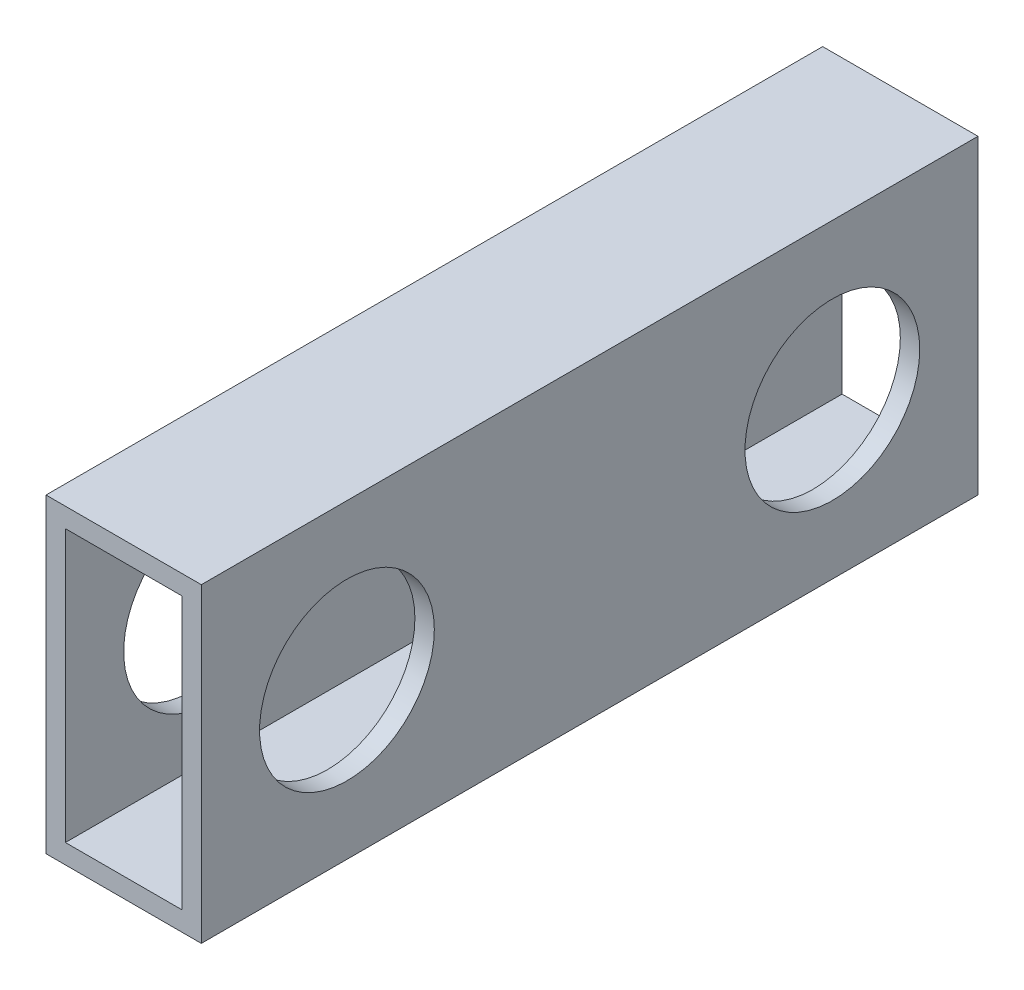
ISO-10303-21;
HEADER;
FILE_DESCRIPTION(('STEP AP214'),'2;1');
FILE_NAME('part.step','',(''),(''),'','','');
FILE_SCHEMA(('AUTOMOTIVE_DESIGN { 1 0 10303 214 1 1 1 1 }'));
ENDSEC;
DATA;
#1=APPLICATION_CONTEXT('core data for automotive mechanical design processes');
#2=APPLICATION_PROTOCOL_DEFINITION('international standard','automotive_design',2000,#1);
#3=PRODUCT_CONTEXT('',#1,'mechanical');
#4=PRODUCT('Part','Part','',(#3));
#5=PRODUCT_RELATED_PRODUCT_CATEGORY('part','',(#4));
#6=PRODUCT_DEFINITION_FORMATION('','',#4);
#7=PRODUCT_DEFINITION_CONTEXT('part definition',#1,'design');
#8=PRODUCT_DEFINITION('design','',#6,#7);
#9=PRODUCT_DEFINITION_SHAPE('','',#8);
#10=(LENGTH_UNIT() NAMED_UNIT(*) SI_UNIT(.MILLI.,.METRE.));
#11=(NAMED_UNIT(*) PLANE_ANGLE_UNIT() SI_UNIT($,.RADIAN.));
#12=(NAMED_UNIT(*) SI_UNIT($,.STERADIAN.) SOLID_ANGLE_UNIT());
#13=UNCERTAINTY_MEASURE_WITH_UNIT(LENGTH_MEASURE(1.E-05),#10,'distance_accuracy_value','');
#14=(GEOMETRIC_REPRESENTATION_CONTEXT(3) GLOBAL_UNCERTAINTY_ASSIGNED_CONTEXT((#13)) GLOBAL_UNIT_ASSIGNED_CONTEXT((#10,
#11,#12)) REPRESENTATION_CONTEXT('',''));
#15=CARTESIAN_POINT('',(0.,0.,0.));
#16=DIRECTION('',(0.,0.,1.));
#17=DIRECTION('',(1.,0.,0.));
#18=AXIS2_PLACEMENT_3D('',#15,#16,#17);
#19=CARTESIAN_POINT('',(12.7,25.4,63.5));
#20=DIRECTION('',(-1.,0.,0.));
#21=DIRECTION('',(0.,0.,1.));
#22=AXIS2_PLACEMENT_3D('',#19,#20,#21);
#23=PLANE('',#22);
#24=CARTESIAN_POINT('',(12.7,0.,-39.6875));
#25=DIRECTION('',(1.,0.,0.));
#26=DIRECTION('',(0.,0.,-1.));
#27=AXIS2_PLACEMENT_3D('',#24,#25,#26);
#28=CIRCLE('',#27,14.2875);
#29=CARTESIAN_POINT('',(12.7,0.,-53.975));
#30=VERTEX_POINT('',#29);
#31=EDGE_CURVE('E171',#30,#30,#28,.T.);
#32=ORIENTED_EDGE('',*,*,#31,.F.);
#33=EDGE_LOOP('',(#32));
#34=FACE_BOUND('',#33,.T.);
#35=CARTESIAN_POINT('',(12.7,0.,39.6875));
#36=DIRECTION('',(1.,0.,0.));
#37=DIRECTION('',(0.,0.,-1.));
#38=AXIS2_PLACEMENT_3D('',#35,#36,#37);
#39=CIRCLE('',#38,14.2875);
#40=CARTESIAN_POINT('',(12.7,0.,25.4));
#41=VERTEX_POINT('',#40);
#42=EDGE_CURVE('E176',#41,#41,#39,.T.);
#43=ORIENTED_EDGE('',*,*,#42,.F.);
#44=EDGE_LOOP('',(#43));
#45=FACE_BOUND('',#44,.T.);
#46=DIRECTION('',(0.,1.,0.));
#47=VECTOR('',#46,1.);
#48=CARTESIAN_POINT('',(12.7,25.4,-63.5));
#49=LINE('',#48,#47);
#50=CARTESIAN_POINT('',(12.7,-25.4,-63.5));
#51=VERTEX_POINT('',#50);
#52=CARTESIAN_POINT('',(12.7,25.4,-63.5));
#53=VERTEX_POINT('',#52);
#54=EDGE_CURVE('E148',#51,#53,#49,.T.);
#55=ORIENTED_EDGE('',*,*,#54,.T.);
#56=DIRECTION('',(0.,0.,-1.));
#57=VECTOR('',#56,1.);
#58=CARTESIAN_POINT('',(12.7,25.4,63.5));
#59=LINE('',#58,#57);
#60=CARTESIAN_POINT('',(12.7,25.4,63.5));
#61=VERTEX_POINT('',#60);
#62=EDGE_CURVE('E11',#61,#53,#59,.T.);
#63=ORIENTED_EDGE('',*,*,#62,.F.);
#64=DIRECTION('',(0.,1.,0.));
#65=VECTOR('',#64,1.);
#66=CARTESIAN_POINT('',(12.7,25.4,63.5));
#67=LINE('',#66,#65);
#68=CARTESIAN_POINT('',(12.7,-25.4,63.5));
#69=VERTEX_POINT('',#68);
#70=EDGE_CURVE('E137',#69,#61,#67,.T.);
#71=ORIENTED_EDGE('',*,*,#70,.F.);
#72=DIRECTION('',(0.,0.,-1.));
#73=VECTOR('',#72,1.);
#74=CARTESIAN_POINT('',(12.7,-25.4,63.5));
#75=LINE('',#74,#73);
#76=EDGE_CURVE('E147',#69,#51,#75,.T.);
#77=ORIENTED_EDGE('',*,*,#76,.T.);
#78=EDGE_LOOP('',(#55,#63,#71,#77));
#79=FACE_BOUND('',#78,.T.);
#80=ADVANCED_FACE('F37',(#34,#45,#79),#23,.F.);
#81=CARTESIAN_POINT('',(-12.7,25.4,63.5));
#82=DIRECTION('',(0.,-1.,0.));
#83=DIRECTION('',(0.,0.,-1.));
#84=AXIS2_PLACEMENT_3D('',#81,#82,#83);
#85=PLANE('',#84);
#86=DIRECTION('',(-1.,0.,0.));
#87=VECTOR('',#86,1.);
#88=CARTESIAN_POINT('',(-12.7,25.4,-63.5));
#89=LINE('',#88,#87);
#90=CARTESIAN_POINT('',(-12.7,25.4,-63.5));
#91=VERTEX_POINT('',#90);
#92=EDGE_CURVE('E151',#53,#91,#89,.T.);
#93=ORIENTED_EDGE('',*,*,#92,.T.);
#94=DIRECTION('',(0.,0.,-1.));
#95=VECTOR('',#94,1.);
#96=CARTESIAN_POINT('',(-12.7,25.4,63.5));
#97=LINE('',#96,#95);
#98=CARTESIAN_POINT('',(-12.7,25.4,63.5));
#99=VERTEX_POINT('',#98);
#100=EDGE_CURVE('E45',#99,#91,#97,.T.);
#101=ORIENTED_EDGE('',*,*,#100,.F.);
#102=DIRECTION('',(-1.,0.,0.));
#103=VECTOR('',#102,1.);
#104=CARTESIAN_POINT('',(-12.7,25.4,63.5));
#105=LINE('',#104,#103);
#106=EDGE_CURVE('E140',#61,#99,#105,.T.);
#107=ORIENTED_EDGE('',*,*,#106,.F.);
#108=ORIENTED_EDGE('',*,*,#62,.T.);
#109=EDGE_LOOP('',(#93,#101,#107,#108));
#110=FACE_BOUND('',#109,.T.);
#111=ADVANCED_FACE('F209',(#110),#85,.F.);
#112=CARTESIAN_POINT('',(-12.7,25.4,63.5));
#113=DIRECTION('',(1.,0.,0.));
#114=DIRECTION('',(0.,0.,-1.));
#115=AXIS2_PLACEMENT_3D('',#112,#113,#114);
#116=PLANE('',#115);
#117=CARTESIAN_POINT('',(-12.7,0.,-39.6875));
#118=DIRECTION('',(1.,0.,0.));
#119=DIRECTION('',(0.,0.,-1.));
#120=AXIS2_PLACEMENT_3D('',#117,#118,#119);
#121=CIRCLE('',#120,14.2875);
#122=CARTESIAN_POINT('',(-12.7,0.,-53.975));
#123=VERTEX_POINT('',#122);
#124=EDGE_CURVE('E165',#123,#123,#121,.T.);
#125=ORIENTED_EDGE('',*,*,#124,.T.);
#126=EDGE_LOOP('',(#125));
#127=FACE_BOUND('',#126,.T.);
#128=CARTESIAN_POINT('',(-12.7,0.,39.6875));
#129=DIRECTION('',(1.,0.,0.));
#130=DIRECTION('',(0.,0.,-1.));
#131=AXIS2_PLACEMENT_3D('',#128,#129,#130);
#132=CIRCLE('',#131,14.2875);
#133=CARTESIAN_POINT('',(-12.7,0.,25.4));
#134=VERTEX_POINT('',#133);
#135=EDGE_CURVE('E181',#134,#134,#132,.T.);
#136=ORIENTED_EDGE('',*,*,#135,.T.);
#137=EDGE_LOOP('',(#136));
#138=FACE_BOUND('',#137,.T.);
#139=DIRECTION('',(0.,-1.,0.));
#140=VECTOR('',#139,1.);
#141=CARTESIAN_POINT('',(-12.7,25.4,-63.5));
#142=LINE('',#141,#140);
#143=CARTESIAN_POINT('',(-12.7,-25.4,-63.5));
#144=VERTEX_POINT('',#143);
#145=EDGE_CURVE('E153',#91,#144,#142,.T.);
#146=ORIENTED_EDGE('',*,*,#145,.T.);
#147=DIRECTION('',(0.,0.,-1.));
#148=VECTOR('',#147,1.);
#149=CARTESIAN_POINT('',(-12.7,-25.4,63.5));
#150=LINE('',#149,#148);
#151=CARTESIAN_POINT('',(-12.7,-25.4,63.5));
#152=VERTEX_POINT('',#151);
#153=EDGE_CURVE('E158',#152,#144,#150,.T.);
#154=ORIENTED_EDGE('',*,*,#153,.F.);
#155=DIRECTION('',(0.,-1.,0.));
#156=VECTOR('',#155,1.);
#157=CARTESIAN_POINT('',(-12.7,25.4,63.5));
#158=LINE('',#157,#156);
#159=EDGE_CURVE('E143',#99,#152,#158,.T.);
#160=ORIENTED_EDGE('',*,*,#159,.F.);
#161=ORIENTED_EDGE('',*,*,#100,.T.);
#162=EDGE_LOOP('',(#146,#154,#160,#161));
#163=FACE_BOUND('',#162,.T.);
#164=ADVANCED_FACE('F216',(#127,#138,#163),#116,.F.);
#165=CARTESIAN_POINT('',(-12.7,-25.4,63.5));
#166=DIRECTION('',(0.,1.,0.));
#167=DIRECTION('',(0.,0.,1.));
#168=AXIS2_PLACEMENT_3D('',#165,#166,#167);
#169=PLANE('',#168);
#170=DIRECTION('',(1.,0.,0.));
#171=VECTOR('',#170,1.);
#172=CARTESIAN_POINT('',(-12.7,-25.4,-63.5));
#173=LINE('',#172,#171);
#174=EDGE_CURVE('E141',#144,#51,#173,.T.);
#175=ORIENTED_EDGE('',*,*,#174,.T.);
#176=ORIENTED_EDGE('',*,*,#76,.F.);
#177=DIRECTION('',(1.,0.,0.));
#178=VECTOR('',#177,1.);
#179=CARTESIAN_POINT('',(-12.7,-25.4,63.5));
#180=LINE('',#179,#178);
#181=EDGE_CURVE('E145',#152,#69,#180,.T.);
#182=ORIENTED_EDGE('',*,*,#181,.F.);
#183=ORIENTED_EDGE('',*,*,#153,.T.);
#184=EDGE_LOOP('',(#175,#176,#182,#183));
#185=FACE_BOUND('',#184,.T.);
#186=ADVANCED_FACE('F233',(#185),#169,.F.);
#187=CARTESIAN_POINT('',(0.,0.,63.5));
#188=DIRECTION('',(0.,0.,1.));
#189=DIRECTION('',(1.,0.,0.));
#190=AXIS2_PLACEMENT_3D('',#187,#188,#189);
#191=PLANE('',#190);
#192=DIRECTION('',(0.,1.,0.));
#193=VECTOR('',#192,1.);
#194=CARTESIAN_POINT('',(9.525,25.4,63.5));
#195=LINE('',#194,#193);
#196=CARTESIAN_POINT('',(9.525,-22.225,63.5));
#197=VERTEX_POINT('',#196);
#198=CARTESIAN_POINT('',(9.525,22.225,63.5));
#199=VERTEX_POINT('',#198);
#200=EDGE_CURVE('E125',#197,#199,#195,.T.);
#201=ORIENTED_EDGE('',*,*,#200,.F.);
#202=DIRECTION('',(1.,0.,0.));
#203=VECTOR('',#202,1.);
#204=CARTESIAN_POINT('',(-12.7,-22.225,63.5));
#205=LINE('',#204,#203);
#206=CARTESIAN_POINT('',(-9.525,-22.225,63.5));
#207=VERTEX_POINT('',#206);
#208=EDGE_CURVE('E108',#207,#197,#205,.T.);
#209=ORIENTED_EDGE('',*,*,#208,.F.);
#210=DIRECTION('',(0.,-1.,0.));
#211=VECTOR('',#210,1.);
#212=CARTESIAN_POINT('',(-9.525,25.4,63.5));
#213=LINE('',#212,#211);
#214=CARTESIAN_POINT('',(-9.525,22.225,63.5));
#215=VERTEX_POINT('',#214);
#216=EDGE_CURVE('E134',#215,#207,#213,.T.);
#217=ORIENTED_EDGE('',*,*,#216,.F.);
#218=DIRECTION('',(-1.,0.,0.));
#219=VECTOR('',#218,1.);
#220=CARTESIAN_POINT('',(-12.7,22.225,63.5));
#221=LINE('',#220,#219);
#222=EDGE_CURVE('E127',#199,#215,#221,.T.);
#223=ORIENTED_EDGE('',*,*,#222,.F.);
#224=EDGE_LOOP('',(#201,#209,#217,#223));
#225=FACE_BOUND('',#224,.T.);
#226=ORIENTED_EDGE('',*,*,#70,.T.);
#227=ORIENTED_EDGE('',*,*,#106,.T.);
#228=ORIENTED_EDGE('',*,*,#159,.T.);
#229=ORIENTED_EDGE('',*,*,#181,.T.);
#230=EDGE_LOOP('',(#226,#227,#228,#229));
#231=FACE_BOUND('',#230,.T.);
#232=ADVANCED_FACE('F192',(#225,#231),#191,.T.);
#233=CARTESIAN_POINT('',(0.,0.,-63.5));
#234=DIRECTION('',(0.,0.,1.));
#235=DIRECTION('',(1.,0.,0.));
#236=AXIS2_PLACEMENT_3D('',#233,#234,#235);
#237=PLANE('',#236);
#238=DIRECTION('',(1.,0.,0.));
#239=VECTOR('',#238,1.);
#240=CARTESIAN_POINT('',(-12.7,-22.225,-63.5));
#241=LINE('',#240,#239);
#242=CARTESIAN_POINT('',(-9.525,-22.225,-63.5));
#243=VERTEX_POINT('',#242);
#244=CARTESIAN_POINT('',(9.525,-22.225,-63.5));
#245=VERTEX_POINT('',#244);
#246=EDGE_CURVE('E106',#243,#245,#241,.T.);
#247=ORIENTED_EDGE('',*,*,#246,.T.);
#248=DIRECTION('',(0.,1.,0.));
#249=VECTOR('',#248,1.);
#250=CARTESIAN_POINT('',(9.525,25.4,-63.5));
#251=LINE('',#250,#249);
#252=CARTESIAN_POINT('',(9.525,22.225,-63.5));
#253=VERTEX_POINT('',#252);
#254=EDGE_CURVE('E114',#245,#253,#251,.T.);
#255=ORIENTED_EDGE('',*,*,#254,.T.);
#256=DIRECTION('',(-1.,0.,0.));
#257=VECTOR('',#256,1.);
#258=CARTESIAN_POINT('',(-12.7,22.225,-63.5));
#259=LINE('',#258,#257);
#260=CARTESIAN_POINT('',(-9.525,22.225,-63.5));
#261=VERTEX_POINT('',#260);
#262=EDGE_CURVE('E120',#253,#261,#259,.T.);
#263=ORIENTED_EDGE('',*,*,#262,.T.);
#264=DIRECTION('',(0.,-1.,0.));
#265=VECTOR('',#264,1.);
#266=CARTESIAN_POINT('',(-9.525,25.4,-63.5));
#267=LINE('',#266,#265);
#268=EDGE_CURVE('E60',#261,#243,#267,.T.);
#269=ORIENTED_EDGE('',*,*,#268,.T.);
#270=EDGE_LOOP('',(#247,#255,#263,#269));
#271=FACE_BOUND('',#270,.T.);
#272=ORIENTED_EDGE('',*,*,#54,.F.);
#273=ORIENTED_EDGE('',*,*,#174,.F.);
#274=ORIENTED_EDGE('',*,*,#145,.F.);
#275=ORIENTED_EDGE('',*,*,#92,.F.);
#276=EDGE_LOOP('',(#272,#273,#274,#275));
#277=FACE_BOUND('',#276,.T.);
#278=ADVANCED_FACE('F123',(#271,#277),#237,.F.);
#279=CARTESIAN_POINT('',(9.525,25.4,63.5));
#280=DIRECTION('',(-1.,0.,0.));
#281=DIRECTION('',(0.,0.,1.));
#282=AXIS2_PLACEMENT_3D('',#279,#280,#281);
#283=PLANE('',#282);
#284=CARTESIAN_POINT('',(9.525,0.,-39.6875));
#285=DIRECTION('',(-1.,0.,0.));
#286=DIRECTION('',(0.,0.,1.));
#287=AXIS2_PLACEMENT_3D('',#284,#285,#286);
#288=CIRCLE('',#287,14.2875);
#289=CARTESIAN_POINT('',(9.525,0.,-25.4));
#290=VERTEX_POINT('',#289);
#291=EDGE_CURVE('E121',#290,#290,#288,.T.);
#292=ORIENTED_EDGE('',*,*,#291,.F.);
#293=EDGE_LOOP('',(#292));
#294=FACE_BOUND('',#293,.T.);
#295=CARTESIAN_POINT('',(9.525,0.,39.6875));
#296=DIRECTION('',(-1.,0.,0.));
#297=DIRECTION('',(0.,0.,1.));
#298=AXIS2_PLACEMENT_3D('',#295,#296,#297);
#299=CIRCLE('',#298,14.2875);
#300=CARTESIAN_POINT('',(9.525,0.,53.975));
#301=VERTEX_POINT('',#300);
#302=EDGE_CURVE('E164',#301,#301,#299,.T.);
#303=ORIENTED_EDGE('',*,*,#302,.F.);
#304=EDGE_LOOP('',(#303));
#305=FACE_BOUND('',#304,.T.);
#306=ORIENTED_EDGE('',*,*,#254,.F.);
#307=DIRECTION('',(0.,0.,-1.));
#308=VECTOR('',#307,1.);
#309=CARTESIAN_POINT('',(9.525,-22.225,63.5));
#310=LINE('',#309,#308);
#311=EDGE_CURVE('E102',#197,#245,#310,.T.);
#312=ORIENTED_EDGE('',*,*,#311,.F.);
#313=ORIENTED_EDGE('',*,*,#200,.T.);
#314=DIRECTION('',(0.,0.,-1.));
#315=VECTOR('',#314,1.);
#316=CARTESIAN_POINT('',(9.525,22.225,63.5));
#317=LINE('',#316,#315);
#318=EDGE_CURVE('E117',#199,#253,#317,.T.);
#319=ORIENTED_EDGE('',*,*,#318,.T.);
#320=EDGE_LOOP('',(#306,#312,#313,#319));
#321=FACE_BOUND('',#320,.T.);
#322=ADVANCED_FACE('F115',(#294,#305,#321),#283,.T.);
#323=CARTESIAN_POINT('',(-12.7,22.225,63.5));
#324=DIRECTION('',(0.,-1.,0.));
#325=DIRECTION('',(0.,0.,-1.));
#326=AXIS2_PLACEMENT_3D('',#323,#324,#325);
#327=PLANE('',#326);
#328=ORIENTED_EDGE('',*,*,#262,.F.);
#329=ORIENTED_EDGE('',*,*,#318,.F.);
#330=ORIENTED_EDGE('',*,*,#222,.T.);
#331=DIRECTION('',(0.,0.,-1.));
#332=VECTOR('',#331,1.);
#333=CARTESIAN_POINT('',(-9.525,22.225,63.5));
#334=LINE('',#333,#332);
#335=EDGE_CURVE('E186',#215,#261,#334,.T.);
#336=ORIENTED_EDGE('',*,*,#335,.T.);
#337=EDGE_LOOP('',(#328,#329,#330,#336));
#338=FACE_BOUND('',#337,.T.);
#339=ADVANCED_FACE('F195',(#338),#327,.T.);
#340=CARTESIAN_POINT('',(-9.525,25.4,63.5));
#341=DIRECTION('',(1.,0.,0.));
#342=DIRECTION('',(0.,0.,-1.));
#343=AXIS2_PLACEMENT_3D('',#340,#341,#342);
#344=PLANE('',#343);
#345=CARTESIAN_POINT('',(-9.525,0.,-39.6875));
#346=DIRECTION('',(1.,0.,0.));
#347=DIRECTION('',(0.,0.,-1.));
#348=AXIS2_PLACEMENT_3D('',#345,#346,#347);
#349=CIRCLE('',#348,14.2875);
#350=CARTESIAN_POINT('',(-9.525,0.,-53.975));
#351=VERTEX_POINT('',#350);
#352=EDGE_CURVE('E40',#351,#351,#349,.T.);
#353=ORIENTED_EDGE('',*,*,#352,.F.);
#354=EDGE_LOOP('',(#353));
#355=FACE_BOUND('',#354,.T.);
#356=CARTESIAN_POINT('',(-9.525,0.,39.6875));
#357=DIRECTION('',(1.,0.,0.));
#358=DIRECTION('',(0.,0.,-1.));
#359=AXIS2_PLACEMENT_3D('',#356,#357,#358);
#360=CIRCLE('',#359,14.2875);
#361=CARTESIAN_POINT('',(-9.525,0.,25.4));
#362=VERTEX_POINT('',#361);
#363=EDGE_CURVE('E162',#362,#362,#360,.T.);
#364=ORIENTED_EDGE('',*,*,#363,.F.);
#365=EDGE_LOOP('',(#364));
#366=FACE_BOUND('',#365,.T.);
#367=ORIENTED_EDGE('',*,*,#268,.F.);
#368=ORIENTED_EDGE('',*,*,#335,.F.);
#369=ORIENTED_EDGE('',*,*,#216,.T.);
#370=DIRECTION('',(0.,0.,-1.));
#371=VECTOR('',#370,1.);
#372=CARTESIAN_POINT('',(-9.525,-22.225,63.5));
#373=LINE('',#372,#371);
#374=EDGE_CURVE('E53',#207,#243,#373,.T.);
#375=ORIENTED_EDGE('',*,*,#374,.T.);
#376=EDGE_LOOP('',(#367,#368,#369,#375));
#377=FACE_BOUND('',#376,.T.);
#378=ADVANCED_FACE('F188',(#355,#366,#377),#344,.T.);
#379=CARTESIAN_POINT('',(-12.7,-22.225,63.5));
#380=DIRECTION('',(0.,1.,0.));
#381=DIRECTION('',(0.,0.,1.));
#382=AXIS2_PLACEMENT_3D('',#379,#380,#381);
#383=PLANE('',#382);
#384=ORIENTED_EDGE('',*,*,#246,.F.);
#385=ORIENTED_EDGE('',*,*,#374,.F.);
#386=ORIENTED_EDGE('',*,*,#208,.T.);
#387=ORIENTED_EDGE('',*,*,#311,.T.);
#388=EDGE_LOOP('',(#384,#385,#386,#387));
#389=FACE_BOUND('',#388,.T.);
#390=ADVANCED_FACE('F104',(#389),#383,.T.);
#391=CARTESIAN_POINT('',(-12.7,0.,39.6875));
#392=DIRECTION('',(1.,0.,0.));
#393=DIRECTION('',(0.,0.,-1.));
#394=AXIS2_PLACEMENT_3D('',#391,#392,#393);
#395=CYLINDRICAL_SURFACE('',#394,14.2875);
#396=ORIENTED_EDGE('',*,*,#363,.T.);
#397=EDGE_LOOP('',(#396));
#398=FACE_BOUND('',#397,.T.);
#399=ORIENTED_EDGE('',*,*,#135,.F.);
#400=EDGE_LOOP('',(#399));
#401=FACE_BOUND('',#400,.T.);
#402=ADVANCED_FACE('F247',(#398,#401),#395,.F.);
#403=CARTESIAN_POINT('',(-12.7,0.,-39.6875));
#404=DIRECTION('',(1.,0.,0.));
#405=DIRECTION('',(0.,0.,-1.));
#406=AXIS2_PLACEMENT_3D('',#403,#404,#405);
#407=CYLINDRICAL_SURFACE('',#406,14.2875);
#408=ORIENTED_EDGE('',*,*,#352,.T.);
#409=EDGE_LOOP('',(#408));
#410=FACE_BOUND('',#409,.T.);
#411=ORIENTED_EDGE('',*,*,#124,.F.);
#412=EDGE_LOOP('',(#411));
#413=FACE_BOUND('',#412,.T.);
#414=ADVANCED_FACE('F250',(#410,#413),#407,.F.);
#415=ORIENTED_EDGE('',*,*,#302,.T.);
#416=EDGE_LOOP('',(#415));
#417=FACE_BOUND('',#416,.T.);
#418=ORIENTED_EDGE('',*,*,#42,.T.);
#419=EDGE_LOOP('',(#418));
#420=FACE_BOUND('',#419,.T.);
#421=ADVANCED_FACE('F252',(#417,#420),#395,.F.);
#422=ORIENTED_EDGE('',*,*,#291,.T.);
#423=EDGE_LOOP('',(#422));
#424=FACE_BOUND('',#423,.T.);
#425=ORIENTED_EDGE('',*,*,#31,.T.);
#426=EDGE_LOOP('',(#425));
#427=FACE_BOUND('',#426,.T.);
#428=ADVANCED_FACE('F258',(#424,#427),#407,.F.);
#429=CLOSED_SHELL('',(#80,#111,#164,#186,#232,#278,#322,#339,#378,#390,#402,#414,#421,#428));
#430=MANIFOLD_SOLID_BREP('B2',#429);
#431=ADVANCED_BREP_SHAPE_REPRESENTATION('',(#18,#430),#14);
#432=SHAPE_DEFINITION_REPRESENTATION(#9,#431);
ENDSEC;
END-ISO-10303-21;
